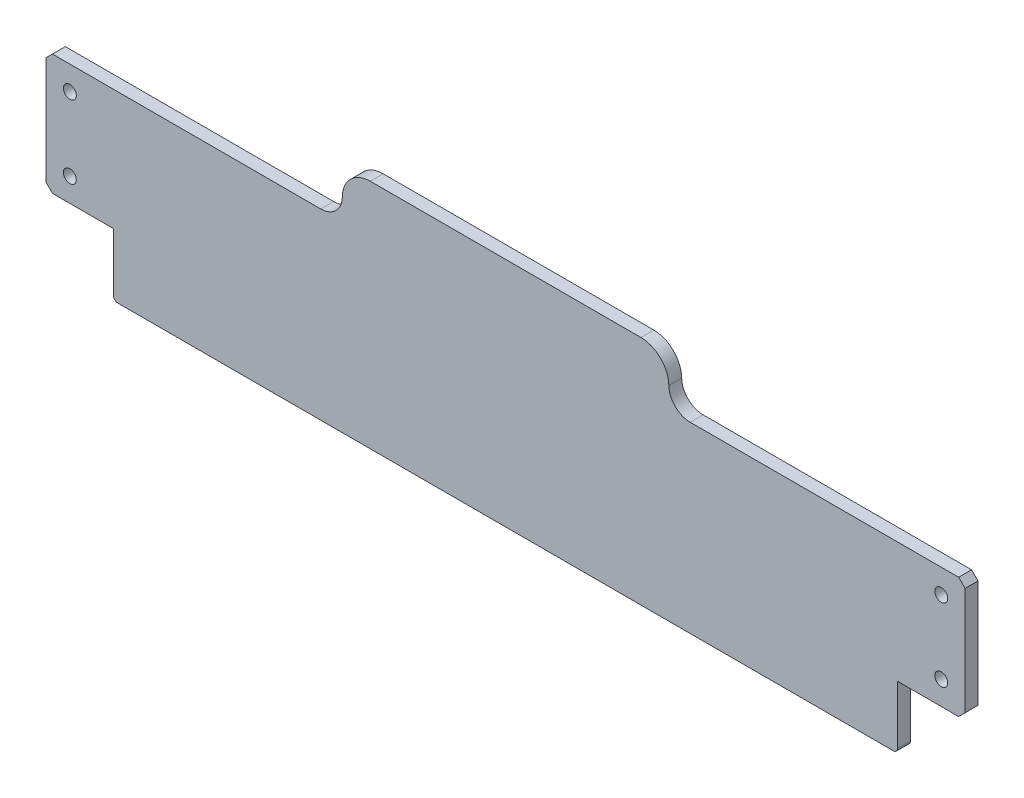
ISO-10303-21;
HEADER;
FILE_DESCRIPTION(('STEP AP214'),'2;1');
FILE_NAME('part.step','',(''),(''),'','','');
FILE_SCHEMA(('AUTOMOTIVE_DESIGN { 1 0 10303 214 1 1 1 1 }'));
ENDSEC;
DATA;
#1=APPLICATION_CONTEXT('core data for automotive mechanical design processes');
#2=APPLICATION_PROTOCOL_DEFINITION('international standard','automotive_design',2000,#1);
#3=PRODUCT_CONTEXT('',#1,'mechanical');
#4=PRODUCT('Part','Part','',(#3));
#5=PRODUCT_RELATED_PRODUCT_CATEGORY('part','',(#4));
#6=PRODUCT_DEFINITION_FORMATION('','',#4);
#7=PRODUCT_DEFINITION_CONTEXT('part definition',#1,'design');
#8=PRODUCT_DEFINITION('design','',#6,#7);
#9=PRODUCT_DEFINITION_SHAPE('','',#8);
#10=(LENGTH_UNIT() NAMED_UNIT(*) SI_UNIT(.MILLI.,.METRE.));
#11=(NAMED_UNIT(*) PLANE_ANGLE_UNIT() SI_UNIT($,.RADIAN.));
#12=(NAMED_UNIT(*) SI_UNIT($,.STERADIAN.) SOLID_ANGLE_UNIT());
#13=UNCERTAINTY_MEASURE_WITH_UNIT(LENGTH_MEASURE(1.E-05),#10,'distance_accuracy_value','');
#14=(GEOMETRIC_REPRESENTATION_CONTEXT(3) GLOBAL_UNCERTAINTY_ASSIGNED_CONTEXT((#13)) GLOBAL_UNIT_ASSIGNED_CONTEXT((#10,
#11,#12)) REPRESENTATION_CONTEXT('',''));
#15=CARTESIAN_POINT('',(0.,0.,0.));
#16=DIRECTION('',(0.,0.,1.));
#17=DIRECTION('',(1.,0.,0.));
#18=AXIS2_PLACEMENT_3D('',#15,#16,#17);
#19=CARTESIAN_POINT('',(0.,0.,6.));
#20=DIRECTION('',(-1.,0.,0.));
#21=DIRECTION('',(0.,0.,1.));
#22=AXIS2_PLACEMENT_3D('',#19,#20,#21);
#23=PLANE('',#22);
#24=DIRECTION('',(0.,1.,0.));
#25=VECTOR('',#24,1.);
#26=CARTESIAN_POINT('',(0.,0.,0.));
#27=LINE('',#26,#25);
#28=CARTESIAN_POINT('',(0.,-10.,0.));
#29=VERTEX_POINT('',#28);
#30=CARTESIAN_POINT('',(0.,17.,0.));
#31=VERTEX_POINT('',#30);
#32=EDGE_CURVE('E184',#29,#31,#27,.T.);
#33=ORIENTED_EDGE('',*,*,#32,.F.);
#34=DIRECTION('',(0.,0.,1.));
#35=VECTOR('',#34,1.);
#36=CARTESIAN_POINT('',(0.,-10.,6.));
#37=LINE('',#36,#35);
#38=CARTESIAN_POINT('',(0.,-10.,6.));
#39=VERTEX_POINT('',#38);
#40=EDGE_CURVE('E328',#29,#39,#37,.T.);
#41=ORIENTED_EDGE('',*,*,#40,.T.);
#42=DIRECTION('',(0.,1.,0.));
#43=VECTOR('',#42,1.);
#44=CARTESIAN_POINT('',(0.,0.,6.));
#45=LINE('',#44,#43);
#46=CARTESIAN_POINT('',(0.,17.,6.));
#47=VERTEX_POINT('',#46);
#48=EDGE_CURVE('E204',#39,#47,#45,.T.);
#49=ORIENTED_EDGE('',*,*,#48,.T.);
#50=DIRECTION('',(0.,0.,1.));
#51=VECTOR('',#50,1.);
#52=CARTESIAN_POINT('',(0.,17.,0.));
#53=LINE('',#52,#51);
#54=EDGE_CURVE('E202',#31,#47,#53,.T.);
#55=ORIENTED_EDGE('',*,*,#54,.F.);
#56=EDGE_LOOP('',(#33,#41,#49,#55));
#57=FACE_BOUND('',#56,.T.);
#58=ADVANCED_FACE('F44',(#57),#23,.T.);
#59=CARTESIAN_POINT('',(365.,0.,6.));
#60=DIRECTION('',(-1.,0.,0.));
#61=DIRECTION('',(0.,0.,1.));
#62=AXIS2_PLACEMENT_3D('',#59,#60,#61);
#63=PLANE('',#62);
#64=DIRECTION('',(0.,1.,0.));
#65=VECTOR('',#64,1.);
#66=CARTESIAN_POINT('',(365.,0.,6.));
#67=LINE('',#66,#65);
#68=CARTESIAN_POINT('',(365.,-10.,6.));
#69=VERTEX_POINT('',#68);
#70=CARTESIAN_POINT('',(365.,17.,6.));
#71=VERTEX_POINT('',#70);
#72=EDGE_CURVE('E198',#69,#71,#67,.T.);
#73=ORIENTED_EDGE('',*,*,#72,.F.);
#74=DIRECTION('',(0.,0.,1.));
#75=VECTOR('',#74,1.);
#76=CARTESIAN_POINT('',(365.,-10.,0.));
#77=LINE('',#76,#75);
#78=CARTESIAN_POINT('',(365.,-10.,0.));
#79=VERTEX_POINT('',#78);
#80=EDGE_CURVE('E349',#69,#79,#77,.F.);
#81=ORIENTED_EDGE('',*,*,#80,.T.);
#82=DIRECTION('',(0.,1.,0.));
#83=VECTOR('',#82,1.);
#84=CARTESIAN_POINT('',(365.,0.,0.));
#85=LINE('',#84,#83);
#86=CARTESIAN_POINT('',(365.,17.,0.));
#87=VERTEX_POINT('',#86);
#88=EDGE_CURVE('E199',#79,#87,#85,.T.);
#89=ORIENTED_EDGE('',*,*,#88,.T.);
#90=DIRECTION('',(0.,0.,1.));
#91=VECTOR('',#90,1.);
#92=CARTESIAN_POINT('',(365.,17.,0.));
#93=LINE('',#92,#91);
#94=EDGE_CURVE('E224',#87,#71,#93,.T.);
#95=ORIENTED_EDGE('',*,*,#94,.T.);
#96=EDGE_LOOP('',(#73,#81,#89,#95));
#97=FACE_BOUND('',#96,.T.);
#98=ADVANCED_FACE('F449',(#97),#63,.F.);
#99=CARTESIAN_POINT('',(0.,0.,6.));
#100=DIRECTION('',(0.,0.,-1.));
#101=DIRECTION('',(-1.,0.,0.));
#102=AXIS2_PLACEMENT_3D('',#99,#100,#101);
#103=PLANE('',#102);
#104=CARTESIAN_POINT('',(385.300000000001,61.9999999999984,6.));
#105=DIRECTION('',(0.,0.,1.));
#106=DIRECTION('',(-1.,0.,0.));
#107=AXIS2_PLACEMENT_3D('',#104,#105,#106);
#108=CIRCLE('',#107,2.99999999999999);
#109=CARTESIAN_POINT('',(382.300000000001,61.9999999999984,6.));
#110=VERTEX_POINT('',#109);
#111=EDGE_CURVE('E538',#110,#110,#108,.T.);
#112=ORIENTED_EDGE('',*,*,#111,.F.);
#113=EDGE_LOOP('',(#112));
#114=FACE_BOUND('',#113,.T.);
#115=CARTESIAN_POINT('',(385.300000000001,27.9999999999984,6.));
#116=DIRECTION('',(0.,0.,1.));
#117=DIRECTION('',(-1.,0.,0.));
#118=AXIS2_PLACEMENT_3D('',#115,#116,#117);
#119=CIRCLE('',#118,3.00000000000005);
#120=CARTESIAN_POINT('',(382.300000000001,27.9999999999984,6.));
#121=VERTEX_POINT('',#120);
#122=EDGE_CURVE('E542',#121,#121,#119,.T.);
#123=ORIENTED_EDGE('',*,*,#122,.F.);
#124=EDGE_LOOP('',(#123));
#125=FACE_BOUND('',#124,.T.);
#126=CARTESIAN_POINT('',(-20.3000000000008,27.9999999999983,6.));
#127=DIRECTION('',(0.,0.,1.));
#128=DIRECTION('',(1.,0.,0.));
#129=AXIS2_PLACEMENT_3D('',#126,#127,#128);
#130=CIRCLE('',#129,3.);
#131=CARTESIAN_POINT('',(-17.3000000000008,27.9999999999983,6.));
#132=VERTEX_POINT('',#131);
#133=EDGE_CURVE('E546',#132,#132,#130,.T.);
#134=ORIENTED_EDGE('',*,*,#133,.F.);
#135=EDGE_LOOP('',(#134));
#136=FACE_BOUND('',#135,.T.);
#137=CARTESIAN_POINT('',(-20.3000000000008,61.9999999999983,6.));
#138=DIRECTION('',(0.,0.,1.));
#139=DIRECTION('',(1.,0.,0.));
#140=AXIS2_PLACEMENT_3D('',#137,#138,#139);
#141=CIRCLE('',#140,3.);
#142=CARTESIAN_POINT('',(-17.3000000000008,61.9999999999983,6.));
#143=VERTEX_POINT('',#142);
#144=EDGE_CURVE('E417',#143,#143,#141,.T.);
#145=ORIENTED_EDGE('',*,*,#144,.F.);
#146=EDGE_LOOP('',(#145));
#147=FACE_BOUND('',#146,.T.);
#148=DIRECTION('',(1.,0.,0.));
#149=VECTOR('',#148,1.);
#150=CARTESIAN_POINT('',(106.522108858322,95.8688020435436,6.));
#151=LINE('',#150,#149);
#152=CARTESIAN_POINT('',(119.520134136822,95.8688020435436,6.));
#153=VERTEX_POINT('',#152);
#154=CARTESIAN_POINT('',(245.479865863178,95.8688020435436,6.));
#155=VERTEX_POINT('',#154);
#156=EDGE_CURVE('E382',#153,#155,#151,.T.);
#157=ORIENTED_EDGE('',*,*,#156,.F.);
#158=CARTESIAN_POINT('',(119.520134136822,82.8688020435436,6.));
#159=DIRECTION('',(0.,0.,-1.));
#160=DIRECTION('',(-1.,0.,0.));
#161=AXIS2_PLACEMENT_3D('',#158,#159,#160);
#162=CIRCLE('',#161,13.);
#163=CARTESIAN_POINT('',(106.521250283756,83.0391504351327,6.));
#164=VERTEX_POINT('',#163);
#165=EDGE_CURVE('E362',#153,#164,#162,.F.);
#166=ORIENTED_EDGE('',*,*,#165,.T.);
#167=CARTESIAN_POINT('',(96.5221088583215,83.170187659432,6.));
#168=DIRECTION('',(0.,0.,-1.));
#169=DIRECTION('',(-1.,0.,0.));
#170=AXIS2_PLACEMENT_3D('',#167,#168,#169);
#171=CIRCLE('',#170,10.);
#172=CARTESIAN_POINT('',(96.5221088583215,73.170187659432,6.));
#173=VERTEX_POINT('',#172);
#174=EDGE_CURVE('E271',#164,#173,#171,.T.);
#175=ORIENTED_EDGE('',*,*,#174,.T.);
#176=DIRECTION('',(1.,0.,0.));
#177=VECTOR('',#176,1.);
#178=CARTESIAN_POINT('',(18.5737252637614,73.170187659432,6.));
#179=LINE('',#178,#177);
#180=CARTESIAN_POINT('',(-28.4,73.170187659432,6.));
#181=VERTEX_POINT('',#180);
#182=EDGE_CURVE('E236',#181,#173,#179,.T.);
#183=ORIENTED_EDGE('',*,*,#182,.F.);
#184=DIRECTION('',(-0.707106781186541,-0.707106781186554,0.));
#185=VECTOR('',#184,1.);
#186=CARTESIAN_POINT('',(-28.4,73.170187659432,6.));
#187=LINE('',#186,#185);
#188=CARTESIAN_POINT('',(-31.4,70.1701876594319,6.));
#189=VERTEX_POINT('',#188);
#190=EDGE_CURVE('E290',#181,#189,#187,.T.);
#191=ORIENTED_EDGE('',*,*,#190,.T.);
#192=DIRECTION('',(0.,-1.,0.));
#193=VECTOR('',#192,1.);
#194=CARTESIAN_POINT('',(-31.4,17.,6.));
#195=LINE('',#194,#193);
#196=CARTESIAN_POINT('',(-31.4,19.9999999999999,6.));
#197=VERTEX_POINT('',#196);
#198=EDGE_CURVE('E402',#189,#197,#195,.T.);
#199=ORIENTED_EDGE('',*,*,#198,.T.);
#200=DIRECTION('',(0.707106781186548,-0.707106781186548,0.));
#201=VECTOR('',#200,1.);
#202=CARTESIAN_POINT('',(-31.4,19.9999999999999,6.));
#203=LINE('',#202,#201);
#204=CARTESIAN_POINT('',(-28.4000000000001,17.,6.));
#205=VERTEX_POINT('',#204);
#206=EDGE_CURVE('E287',#197,#205,#203,.T.);
#207=ORIENTED_EDGE('',*,*,#206,.T.);
#208=DIRECTION('',(-1.,0.,0.));
#209=VECTOR('',#208,1.);
#210=CARTESIAN_POINT('',(0.,17.,6.));
#211=LINE('',#210,#209);
#212=EDGE_CURVE('E215',#47,#205,#211,.T.);
#213=ORIENTED_EDGE('',*,*,#212,.F.);
#214=ORIENTED_EDGE('',*,*,#48,.F.);
#215=CARTESIAN_POINT('',(2.,-10.,6.));
#216=DIRECTION('',(0.,0.,-1.));
#217=DIRECTION('',(-1.,0.,0.));
#218=AXIS2_PLACEMENT_3D('',#215,#216,#217);
#219=CIRCLE('',#218,2.);
#220=CARTESIAN_POINT('',(2.,-12.,6.));
#221=VERTEX_POINT('',#220);
#222=EDGE_CURVE('E334',#39,#221,#219,.F.);
#223=ORIENTED_EDGE('',*,*,#222,.T.);
#224=DIRECTION('',(1.,0.,0.));
#225=VECTOR('',#224,1.);
#226=CARTESIAN_POINT('',(0.,-12.,6.));
#227=LINE('',#226,#225);
#228=CARTESIAN_POINT('',(363.,-12.,6.));
#229=VERTEX_POINT('',#228);
#230=EDGE_CURVE('E221',#221,#229,#227,.T.);
#231=ORIENTED_EDGE('',*,*,#230,.T.);
#232=CARTESIAN_POINT('',(363.,-10.,6.));
#233=DIRECTION('',(0.,0.,-1.));
#234=DIRECTION('',(-1.,0.,0.));
#235=AXIS2_PLACEMENT_3D('',#232,#233,#234);
#236=CIRCLE('',#235,2.);
#237=EDGE_CURVE('E331',#229,#69,#236,.F.);
#238=ORIENTED_EDGE('',*,*,#237,.T.);
#239=ORIENTED_EDGE('',*,*,#72,.T.);
#240=DIRECTION('',(-1.,0.,0.));
#241=VECTOR('',#240,1.);
#242=CARTESIAN_POINT('',(365.,17.,6.));
#243=LINE('',#242,#241);
#244=CARTESIAN_POINT('',(393.4,17.,6.));
#245=VERTEX_POINT('',#244);
#246=EDGE_CURVE('E218',#245,#71,#243,.T.);
#247=ORIENTED_EDGE('',*,*,#246,.F.);
#248=DIRECTION('',(0.707106781186548,0.707106781186548,0.));
#249=VECTOR('',#248,1.);
#250=CARTESIAN_POINT('',(393.4,17.,6.));
#251=LINE('',#250,#249);
#252=CARTESIAN_POINT('',(396.4,20.,6.));
#253=VERTEX_POINT('',#252);
#254=EDGE_CURVE('E284',#245,#253,#251,.T.);
#255=ORIENTED_EDGE('',*,*,#254,.T.);
#256=DIRECTION('',(0.,1.,0.));
#257=VECTOR('',#256,1.);
#258=CARTESIAN_POINT('',(396.4,17.,6.));
#259=LINE('',#258,#257);
#260=CARTESIAN_POINT('',(396.4,70.170187659432,6.));
#261=VERTEX_POINT('',#260);
#262=EDGE_CURVE('E407',#253,#261,#259,.T.);
#263=ORIENTED_EDGE('',*,*,#262,.T.);
#264=DIRECTION('',(-0.707106781186541,0.707106781186554,0.));
#265=VECTOR('',#264,1.);
#266=CARTESIAN_POINT('',(396.4,70.170187659432,6.));
#267=LINE('',#266,#265);
#268=CARTESIAN_POINT('',(393.4,73.1701876594321,6.));
#269=VERTEX_POINT('',#268);
#270=EDGE_CURVE('E281',#261,#269,#267,.T.);
#271=ORIENTED_EDGE('',*,*,#270,.T.);
#272=DIRECTION('',(1.,0.,0.));
#273=VECTOR('',#272,1.);
#274=CARTESIAN_POINT('',(346.426274736239,73.170187659432,6.));
#275=LINE('',#274,#273);
#276=CARTESIAN_POINT('',(268.477891141679,73.170187659432,6.));
#277=VERTEX_POINT('',#276);
#278=EDGE_CURVE('E209',#277,#269,#275,.T.);
#279=ORIENTED_EDGE('',*,*,#278,.F.);
#280=CARTESIAN_POINT('',(268.477891141679,83.170187659432,6.));
#281=DIRECTION('',(0.,0.,-1.));
#282=DIRECTION('',(-1.,0.,0.));
#283=AXIS2_PLACEMENT_3D('',#280,#281,#282);
#284=CIRCLE('',#283,10.);
#285=CARTESIAN_POINT('',(258.478749716244,83.0391504351327,6.));
#286=VERTEX_POINT('',#285);
#287=EDGE_CURVE('E264',#277,#286,#284,.T.);
#288=ORIENTED_EDGE('',*,*,#287,.T.);
#289=CARTESIAN_POINT('',(245.479865863178,82.8688020435436,6.));
#290=DIRECTION('',(0.,0.,-1.));
#291=DIRECTION('',(-1.,0.,0.));
#292=AXIS2_PLACEMENT_3D('',#289,#290,#291);
#293=CIRCLE('',#292,13.);
#294=EDGE_CURVE('E359',#286,#155,#293,.F.);
#295=ORIENTED_EDGE('',*,*,#294,.T.);
#296=EDGE_LOOP('',(#157,#166,#175,#183,#191,#199,#207,#213,#214,#223,#231,#238,#239,#247,#255,
#263,#271,#279,#288,#295));
#297=FACE_BOUND('',#296,.T.);
#298=ADVANCED_FACE('F386',(#114,#125,#136,#147,#297),#103,.F.);
#299=CARTESIAN_POINT('',(0.,0.,0.));
#300=DIRECTION('',(0.,0.,-1.));
#301=DIRECTION('',(-1.,0.,0.));
#302=AXIS2_PLACEMENT_3D('',#299,#300,#301);
#303=PLANE('',#302);
#304=CARTESIAN_POINT('',(96.5221088583215,83.170187659432,0.));
#305=DIRECTION('',(0.,0.,-1.));
#306=DIRECTION('',(-1.,0.,0.));
#307=AXIS2_PLACEMENT_3D('',#304,#305,#306);
#308=CIRCLE('',#307,10.);
#309=CARTESIAN_POINT('',(96.5221088583215,73.170187659432,0.));
#310=VERTEX_POINT('',#309);
#311=CARTESIAN_POINT('',(106.521250283756,83.0391504351327,0.));
#312=VERTEX_POINT('',#311);
#313=EDGE_CURVE('E274',#310,#312,#308,.F.);
#314=ORIENTED_EDGE('',*,*,#313,.T.);
#315=CARTESIAN_POINT('',(119.520134136822,82.8688020435436,0.));
#316=DIRECTION('',(0.,0.,-1.));
#317=DIRECTION('',(-1.,0.,0.));
#318=AXIS2_PLACEMENT_3D('',#315,#316,#317);
#319=CIRCLE('',#318,13.);
#320=CARTESIAN_POINT('',(119.520134136822,95.8688020435436,0.));
#321=VERTEX_POINT('',#320);
#322=EDGE_CURVE('E53',#312,#321,#319,.T.);
#323=ORIENTED_EDGE('',*,*,#322,.T.);
#324=DIRECTION('',(1.,0.,0.));
#325=VECTOR('',#324,1.);
#326=CARTESIAN_POINT('',(106.522108858322,95.8688020435436,0.));
#327=LINE('',#326,#325);
#328=CARTESIAN_POINT('',(245.479865863178,95.8688020435436,0.));
#329=VERTEX_POINT('',#328);
#330=EDGE_CURVE('E371',#321,#329,#327,.T.);
#331=ORIENTED_EDGE('',*,*,#330,.T.);
#332=CARTESIAN_POINT('',(245.479865863178,82.8688020435436,0.));
#333=DIRECTION('',(0.,0.,-1.));
#334=DIRECTION('',(-1.,0.,0.));
#335=AXIS2_PLACEMENT_3D('',#332,#333,#334);
#336=CIRCLE('',#335,13.);
#337=CARTESIAN_POINT('',(258.478749716244,83.0391504351327,0.));
#338=VERTEX_POINT('',#337);
#339=EDGE_CURVE('E60',#329,#338,#336,.T.);
#340=ORIENTED_EDGE('',*,*,#339,.T.);
#341=CARTESIAN_POINT('',(268.477891141679,83.170187659432,0.));
#342=DIRECTION('',(0.,0.,-1.));
#343=DIRECTION('',(-1.,0.,0.));
#344=AXIS2_PLACEMENT_3D('',#341,#342,#343);
#345=CIRCLE('',#344,10.);
#346=CARTESIAN_POINT('',(268.477891141679,73.170187659432,0.));
#347=VERTEX_POINT('',#346);
#348=EDGE_CURVE('E268',#338,#347,#345,.F.);
#349=ORIENTED_EDGE('',*,*,#348,.T.);
#350=DIRECTION('',(-1.,0.,0.));
#351=VECTOR('',#350,1.);
#352=CARTESIAN_POINT('',(0.,73.1701876594319,0.));
#353=LINE('',#352,#351);
#354=CARTESIAN_POINT('',(393.4,73.1701876594321,0.));
#355=VERTEX_POINT('',#354);
#356=EDGE_CURVE('E247',#355,#347,#353,.T.);
#357=ORIENTED_EDGE('',*,*,#356,.F.);
#358=DIRECTION('',(0.707106781186541,-0.707106781186554,0.));
#359=VECTOR('',#358,1.);
#360=CARTESIAN_POINT('',(233.28509382972,233.285093829715,0.));
#361=LINE('',#360,#359);
#362=CARTESIAN_POINT('',(396.4,70.170187659432,0.));
#363=VERTEX_POINT('',#362);
#364=EDGE_CURVE('E300',#355,#363,#361,.T.);
#365=ORIENTED_EDGE('',*,*,#364,.T.);
#366=DIRECTION('',(0.,1.,0.));
#367=VECTOR('',#366,1.);
#368=CARTESIAN_POINT('',(396.4,17.,0.));
#369=LINE('',#368,#367);
#370=CARTESIAN_POINT('',(396.4,20.,0.));
#371=VERTEX_POINT('',#370);
#372=EDGE_CURVE('E412',#371,#363,#369,.T.);
#373=ORIENTED_EDGE('',*,*,#372,.F.);
#374=DIRECTION('',(-0.707106781186548,-0.707106781186548,0.));
#375=VECTOR('',#374,1.);
#376=CARTESIAN_POINT('',(188.2,-188.2,0.));
#377=LINE('',#376,#375);
#378=CARTESIAN_POINT('',(393.4,17.,0.));
#379=VERTEX_POINT('',#378);
#380=EDGE_CURVE('E303',#371,#379,#377,.T.);
#381=ORIENTED_EDGE('',*,*,#380,.T.);
#382=DIRECTION('',(-1.,0.,0.));
#383=VECTOR('',#382,1.);
#384=CARTESIAN_POINT('',(365.,17.,0.));
#385=LINE('',#384,#383);
#386=EDGE_CURVE('E228',#379,#87,#385,.T.);
#387=ORIENTED_EDGE('',*,*,#386,.T.);
#388=ORIENTED_EDGE('',*,*,#88,.F.);
#389=CARTESIAN_POINT('',(363.,-10.,0.));
#390=DIRECTION('',(0.,0.,-1.));
#391=DIRECTION('',(-1.,0.,0.));
#392=AXIS2_PLACEMENT_3D('',#389,#390,#391);
#393=CIRCLE('',#392,2.);
#394=CARTESIAN_POINT('',(363.,-12.,0.));
#395=VERTEX_POINT('',#394);
#396=EDGE_CURVE('E344',#79,#395,#393,.T.);
#397=ORIENTED_EDGE('',*,*,#396,.T.);
#398=DIRECTION('',(1.,0.,0.));
#399=VECTOR('',#398,1.);
#400=CARTESIAN_POINT('',(0.,-12.,0.));
#401=LINE('',#400,#399);
#402=CARTESIAN_POINT('',(2.,-12.,0.));
#403=VERTEX_POINT('',#402);
#404=EDGE_CURVE('E229',#403,#395,#401,.T.);
#405=ORIENTED_EDGE('',*,*,#404,.F.);
#406=CARTESIAN_POINT('',(2.,-10.,0.));
#407=DIRECTION('',(0.,0.,-1.));
#408=DIRECTION('',(-1.,0.,0.));
#409=AXIS2_PLACEMENT_3D('',#406,#407,#408);
#410=CIRCLE('',#409,2.);
#411=EDGE_CURVE('E193',#403,#29,#410,.T.);
#412=ORIENTED_EDGE('',*,*,#411,.T.);
#413=ORIENTED_EDGE('',*,*,#32,.T.);
#414=DIRECTION('',(-1.,0.,0.));
#415=VECTOR('',#414,1.);
#416=CARTESIAN_POINT('',(0.,17.,0.));
#417=LINE('',#416,#415);
#418=CARTESIAN_POINT('',(-28.4000000000001,17.,0.));
#419=VERTEX_POINT('',#418);
#420=EDGE_CURVE('E189',#31,#419,#417,.T.);
#421=ORIENTED_EDGE('',*,*,#420,.T.);
#422=DIRECTION('',(-0.707106781186548,0.707106781186548,0.));
#423=VECTOR('',#422,1.);
#424=CARTESIAN_POINT('',(-5.70000000000005,-5.70000000000005,0.));
#425=LINE('',#424,#423);
#426=CARTESIAN_POINT('',(-31.4,19.9999999999999,0.));
#427=VERTEX_POINT('',#426);
#428=EDGE_CURVE('E306',#419,#427,#425,.T.);
#429=ORIENTED_EDGE('',*,*,#428,.T.);
#430=DIRECTION('',(0.,-1.,0.));
#431=VECTOR('',#430,1.);
#432=CARTESIAN_POINT('',(-31.4,17.,0.));
#433=LINE('',#432,#431);
#434=CARTESIAN_POINT('',(-31.4,70.1701876594319,0.));
#435=VERTEX_POINT('',#434);
#436=EDGE_CURVE('E396',#435,#427,#433,.T.);
#437=ORIENTED_EDGE('',*,*,#436,.F.);
#438=DIRECTION('',(0.707106781186541,0.707106781186554,0.));
#439=VECTOR('',#438,1.);
#440=CARTESIAN_POINT('',(-50.7850938297163,50.7850938297153,0.));
#441=LINE('',#440,#439);
#442=CARTESIAN_POINT('',(-28.4,73.170187659432,0.));
#443=VERTEX_POINT('',#442);
#444=EDGE_CURVE('E309',#435,#443,#441,.T.);
#445=ORIENTED_EDGE('',*,*,#444,.T.);
#446=DIRECTION('',(-1.,0.,0.));
#447=VECTOR('',#446,1.);
#448=CARTESIAN_POINT('',(0.,73.170187659432,0.));
#449=LINE('',#448,#447);
#450=EDGE_CURVE('E253',#310,#443,#449,.T.);
#451=ORIENTED_EDGE('',*,*,#450,.F.);
#452=EDGE_LOOP('',(#314,#323,#331,#340,#349,#357,#365,#373,#381,#387,#388,#397,#405,#412,#413,
#421,#429,#437,#445,#451));
#453=FACE_BOUND('',#452,.T.);
#454=CARTESIAN_POINT('',(385.300000000001,61.9999999999984,0.));
#455=DIRECTION('',(0.,0.,1.));
#456=DIRECTION('',(-1.,0.,0.));
#457=AXIS2_PLACEMENT_3D('',#454,#455,#456);
#458=CIRCLE('',#457,2.99999999999999);
#459=CARTESIAN_POINT('',(382.300000000001,61.9999999999984,0.));
#460=VERTEX_POINT('',#459);
#461=EDGE_CURVE('E381',#460,#460,#458,.T.);
#462=ORIENTED_EDGE('',*,*,#461,.T.);
#463=EDGE_LOOP('',(#462));
#464=FACE_BOUND('',#463,.T.);
#465=CARTESIAN_POINT('',(385.300000000001,27.9999999999984,0.));
#466=DIRECTION('',(0.,0.,1.));
#467=DIRECTION('',(-1.,0.,0.));
#468=AXIS2_PLACEMENT_3D('',#465,#466,#467);
#469=CIRCLE('',#468,3.00000000000005);
#470=CARTESIAN_POINT('',(382.300000000001,27.9999999999984,0.));
#471=VERTEX_POINT('',#470);
#472=EDGE_CURVE('E564',#471,#471,#469,.T.);
#473=ORIENTED_EDGE('',*,*,#472,.T.);
#474=EDGE_LOOP('',(#473));
#475=FACE_BOUND('',#474,.T.);
#476=CARTESIAN_POINT('',(-20.3000000000008,27.9999999999983,0.));
#477=DIRECTION('',(0.,0.,1.));
#478=DIRECTION('',(1.,0.,0.));
#479=AXIS2_PLACEMENT_3D('',#476,#477,#478);
#480=CIRCLE('',#479,3.);
#481=CARTESIAN_POINT('',(-17.3000000000008,27.9999999999983,0.));
#482=VERTEX_POINT('',#481);
#483=EDGE_CURVE('E554',#482,#482,#480,.T.);
#484=ORIENTED_EDGE('',*,*,#483,.T.);
#485=EDGE_LOOP('',(#484));
#486=FACE_BOUND('',#485,.T.);
#487=CARTESIAN_POINT('',(-20.3000000000008,61.9999999999983,0.));
#488=DIRECTION('',(0.,0.,1.));
#489=DIRECTION('',(1.,0.,0.));
#490=AXIS2_PLACEMENT_3D('',#487,#488,#489);
#491=CIRCLE('',#490,3.);
#492=CARTESIAN_POINT('',(-17.3000000000008,61.9999999999983,0.));
#493=VERTEX_POINT('',#492);
#494=EDGE_CURVE('E414',#493,#493,#491,.T.);
#495=ORIENTED_EDGE('',*,*,#494,.T.);
#496=EDGE_LOOP('',(#495));
#497=FACE_BOUND('',#496,.T.);
#498=ADVANCED_FACE('F186',(#453,#464,#475,#486,#497),#303,.T.);
#499=CARTESIAN_POINT('',(346.426274736239,73.170187659432,-4.));
#500=DIRECTION('',(0.,-1.,0.));
#501=DIRECTION('',(1.,0.,0.));
#502=AXIS2_PLACEMENT_3D('',#499,#500,#501);
#503=PLANE('',#502);
#504=ORIENTED_EDGE('',*,*,#278,.T.);
#505=DIRECTION('',(0.,0.,-1.));
#506=VECTOR('',#505,1.);
#507=CARTESIAN_POINT('',(393.4,73.1701876594321,0.));
#508=LINE('',#507,#506);
#509=EDGE_CURVE('E325',#269,#355,#508,.T.);
#510=ORIENTED_EDGE('',*,*,#509,.T.);
#511=ORIENTED_EDGE('',*,*,#356,.T.);
#512=DIRECTION('',(0.,0.,1.));
#513=VECTOR('',#512,1.);
#514=CARTESIAN_POINT('',(268.477891141679,73.170187659432,6.));
#515=LINE('',#514,#513);
#516=EDGE_CURVE('E257',#347,#277,#515,.T.);
#517=ORIENTED_EDGE('',*,*,#516,.T.);
#518=EDGE_LOOP('',(#504,#510,#511,#517));
#519=FACE_BOUND('',#518,.T.);
#520=ADVANCED_FACE('F526',(#519),#503,.F.);
#521=CARTESIAN_POINT('',(18.5737252637614,73.170187659432,-4.));
#522=DIRECTION('',(0.,-1.,0.));
#523=DIRECTION('',(0.,0.,-1.));
#524=AXIS2_PLACEMENT_3D('',#521,#522,#523);
#525=PLANE('',#524);
#526=ORIENTED_EDGE('',*,*,#450,.T.);
#527=DIRECTION('',(0.,0.,1.));
#528=VECTOR('',#527,1.);
#529=CARTESIAN_POINT('',(-28.4,73.170187659432,6.));
#530=LINE('',#529,#528);
#531=EDGE_CURVE('E277',#443,#181,#530,.T.);
#532=ORIENTED_EDGE('',*,*,#531,.T.);
#533=ORIENTED_EDGE('',*,*,#182,.T.);
#534=DIRECTION('',(0.,0.,1.));
#535=VECTOR('',#534,1.);
#536=CARTESIAN_POINT('',(96.5221088583215,73.170187659432,0.));
#537=LINE('',#536,#535);
#538=EDGE_CURVE('E261',#173,#310,#537,.F.);
#539=ORIENTED_EDGE('',*,*,#538,.T.);
#540=EDGE_LOOP('',(#526,#532,#533,#539));
#541=FACE_BOUND('',#540,.T.);
#542=ADVANCED_FACE('F391',(#541),#525,.F.);
#543=CARTESIAN_POINT('',(268.477891141679,83.170187659432,-4.));
#544=DIRECTION('',(0.,0.,-1.));
#545=DIRECTION('',(-1.,0.,0.));
#546=AXIS2_PLACEMENT_3D('',#543,#544,#545);
#547=CYLINDRICAL_SURFACE('',#546,10.);
#548=ORIENTED_EDGE('',*,*,#348,.F.);
#549=DIRECTION('',(0.,0.,-1.));
#550=VECTOR('',#549,1.);
#551=CARTESIAN_POINT('',(258.478749716244,83.0391504351327,-4.));
#552=LINE('',#551,#550);
#553=EDGE_CURVE('E11',#338,#286,#552,.F.);
#554=ORIENTED_EDGE('',*,*,#553,.T.);
#555=ORIENTED_EDGE('',*,*,#287,.F.);
#556=ORIENTED_EDGE('',*,*,#516,.F.);
#557=EDGE_LOOP('',(#548,#554,#555,#556));
#558=FACE_BOUND('',#557,.T.);
#559=ADVANCED_FACE('F459',(#558),#547,.F.);
#560=CARTESIAN_POINT('',(96.5221088583215,83.170187659432,-4.));
#561=DIRECTION('',(0.,0.,-1.));
#562=DIRECTION('',(-1.,0.,0.));
#563=AXIS2_PLACEMENT_3D('',#560,#561,#562);
#564=CYLINDRICAL_SURFACE('',#563,10.);
#565=ORIENTED_EDGE('',*,*,#174,.F.);
#566=DIRECTION('',(0.,0.,-1.));
#567=VECTOR('',#566,1.);
#568=CARTESIAN_POINT('',(106.521250283756,83.0391504351327,-4.));
#569=LINE('',#568,#567);
#570=EDGE_CURVE('E68',#164,#312,#569,.T.);
#571=ORIENTED_EDGE('',*,*,#570,.T.);
#572=ORIENTED_EDGE('',*,*,#313,.F.);
#573=ORIENTED_EDGE('',*,*,#538,.F.);
#574=EDGE_LOOP('',(#565,#571,#572,#573));
#575=FACE_BOUND('',#574,.T.);
#576=ADVANCED_FACE('F389',(#575),#564,.F.);
#577=CARTESIAN_POINT('',(365.,17.,0.));
#578=DIRECTION('',(0.,1.,0.));
#579=DIRECTION('',(0.,0.,1.));
#580=AXIS2_PLACEMENT_3D('',#577,#578,#579);
#581=PLANE('',#580);
#582=ORIENTED_EDGE('',*,*,#386,.F.);
#583=DIRECTION('',(0.,0.,1.));
#584=VECTOR('',#583,1.);
#585=CARTESIAN_POINT('',(393.4,17.,6.));
#586=LINE('',#585,#584);
#587=EDGE_CURVE('E314',#379,#245,#586,.T.);
#588=ORIENTED_EDGE('',*,*,#587,.T.);
#589=ORIENTED_EDGE('',*,*,#246,.T.);
#590=ORIENTED_EDGE('',*,*,#94,.F.);
#591=EDGE_LOOP('',(#582,#588,#589,#590));
#592=FACE_BOUND('',#591,.T.);
#593=ADVANCED_FACE('F464',(#592),#581,.F.);
#594=CARTESIAN_POINT('',(0.,17.,0.));
#595=DIRECTION('',(0.,1.,0.));
#596=DIRECTION('',(0.,0.,1.));
#597=AXIS2_PLACEMENT_3D('',#594,#595,#596);
#598=PLANE('',#597);
#599=ORIENTED_EDGE('',*,*,#212,.T.);
#600=DIRECTION('',(0.,0.,-1.));
#601=VECTOR('',#600,1.);
#602=CARTESIAN_POINT('',(-28.4000000000001,17.,0.));
#603=LINE('',#602,#601);
#604=EDGE_CURVE('E213',#205,#419,#603,.T.);
#605=ORIENTED_EDGE('',*,*,#604,.T.);
#606=ORIENTED_EDGE('',*,*,#420,.F.);
#607=ORIENTED_EDGE('',*,*,#54,.T.);
#608=EDGE_LOOP('',(#599,#605,#606,#607));
#609=FACE_BOUND('',#608,.T.);
#610=ADVANCED_FACE('F211',(#609),#598,.F.);
#611=CARTESIAN_POINT('',(0.,-12.,0.));
#612=DIRECTION('',(0.,-1.,0.));
#613=DIRECTION('',(0.,0.,-1.));
#614=AXIS2_PLACEMENT_3D('',#611,#612,#613);
#615=PLANE('',#614);
#616=ORIENTED_EDGE('',*,*,#230,.F.);
#617=DIRECTION('',(0.,0.,1.));
#618=VECTOR('',#617,1.);
#619=CARTESIAN_POINT('',(2.,-12.,0.));
#620=LINE('',#619,#618);
#621=EDGE_CURVE('E341',#221,#403,#620,.F.);
#622=ORIENTED_EDGE('',*,*,#621,.T.);
#623=ORIENTED_EDGE('',*,*,#404,.T.);
#624=DIRECTION('',(0.,0.,1.));
#625=VECTOR('',#624,1.);
#626=CARTESIAN_POINT('',(363.,-12.,6.));
#627=LINE('',#626,#625);
#628=EDGE_CURVE('E337',#395,#229,#627,.T.);
#629=ORIENTED_EDGE('',*,*,#628,.T.);
#630=EDGE_LOOP('',(#616,#622,#623,#629));
#631=FACE_BOUND('',#630,.T.);
#632=ADVANCED_FACE('F431',(#631),#615,.T.);
#633=CARTESIAN_POINT('',(396.4,17.,0.));
#634=DIRECTION('',(1.,0.,0.));
#635=DIRECTION('',(0.,0.,-1.));
#636=AXIS2_PLACEMENT_3D('',#633,#634,#635);
#637=PLANE('',#636);
#638=ORIENTED_EDGE('',*,*,#262,.F.);
#639=DIRECTION('',(0.,0.,-1.));
#640=VECTOR('',#639,1.);
#641=CARTESIAN_POINT('',(396.4,20.,0.));
#642=LINE('',#641,#640);
#643=EDGE_CURVE('E322',#253,#371,#642,.T.);
#644=ORIENTED_EDGE('',*,*,#643,.T.);
#645=ORIENTED_EDGE('',*,*,#372,.T.);
#646=DIRECTION('',(0.,0.,1.));
#647=VECTOR('',#646,1.);
#648=CARTESIAN_POINT('',(396.4,70.170187659432,6.));
#649=LINE('',#648,#647);
#650=EDGE_CURVE('E318',#363,#261,#649,.T.);
#651=ORIENTED_EDGE('',*,*,#650,.T.);
#652=EDGE_LOOP('',(#638,#644,#645,#651));
#653=FACE_BOUND('',#652,.T.);
#654=ADVANCED_FACE('F513',(#653),#637,.T.);
#655=CARTESIAN_POINT('',(-31.4,17.,0.));
#656=DIRECTION('',(-1.,0.,0.));
#657=DIRECTION('',(0.,0.,1.));
#658=AXIS2_PLACEMENT_3D('',#655,#656,#657);
#659=PLANE('',#658);
#660=ORIENTED_EDGE('',*,*,#198,.F.);
#661=DIRECTION('',(0.,0.,-1.));
#662=VECTOR('',#661,1.);
#663=CARTESIAN_POINT('',(-31.4,70.1701876594319,0.));
#664=LINE('',#663,#662);
#665=EDGE_CURVE('E297',#189,#435,#664,.T.);
#666=ORIENTED_EDGE('',*,*,#665,.T.);
#667=ORIENTED_EDGE('',*,*,#436,.T.);
#668=DIRECTION('',(0.,0.,1.));
#669=VECTOR('',#668,1.);
#670=CARTESIAN_POINT('',(-31.4,19.9999999999999,6.));
#671=LINE('',#670,#669);
#672=EDGE_CURVE('E293',#427,#197,#671,.T.);
#673=ORIENTED_EDGE('',*,*,#672,.T.);
#674=EDGE_LOOP('',(#660,#666,#667,#673));
#675=FACE_BOUND('',#674,.T.);
#676=ADVANCED_FACE('F404',(#675),#659,.T.);
#677=CARTESIAN_POINT('',(-28.4,73.170187659432,-4.));
#678=DIRECTION('',(-0.707106781186554,0.707106781186541,0.));
#679=DIRECTION('',(0.,0.,-1.));
#680=AXIS2_PLACEMENT_3D('',#677,#678,#679);
#681=PLANE('',#680);
#682=ORIENTED_EDGE('',*,*,#444,.F.);
#683=ORIENTED_EDGE('',*,*,#665,.F.);
#684=ORIENTED_EDGE('',*,*,#190,.F.);
#685=ORIENTED_EDGE('',*,*,#531,.F.);
#686=EDGE_LOOP('',(#682,#683,#684,#685));
#687=FACE_BOUND('',#686,.T.);
#688=ADVANCED_FACE('F399',(#687),#681,.T.);
#689=CARTESIAN_POINT('',(-31.4,19.9999999999999,0.));
#690=DIRECTION('',(-0.707106781186548,-0.707106781186548,0.));
#691=DIRECTION('',(0.,0.,-1.));
#692=AXIS2_PLACEMENT_3D('',#689,#690,#691);
#693=PLANE('',#692);
#694=ORIENTED_EDGE('',*,*,#428,.F.);
#695=ORIENTED_EDGE('',*,*,#604,.F.);
#696=ORIENTED_EDGE('',*,*,#206,.F.);
#697=ORIENTED_EDGE('',*,*,#672,.F.);
#698=EDGE_LOOP('',(#694,#695,#696,#697));
#699=FACE_BOUND('',#698,.T.);
#700=ADVANCED_FACE('F435',(#699),#693,.T.);
#701=CARTESIAN_POINT('',(393.4,17.,0.));
#702=DIRECTION('',(0.707106781186547,-0.707106781186547,0.));
#703=DIRECTION('',(0.,0.,-1.));
#704=AXIS2_PLACEMENT_3D('',#701,#702,#703);
#705=PLANE('',#704);
#706=ORIENTED_EDGE('',*,*,#380,.F.);
#707=ORIENTED_EDGE('',*,*,#643,.F.);
#708=ORIENTED_EDGE('',*,*,#254,.F.);
#709=ORIENTED_EDGE('',*,*,#587,.F.);
#710=EDGE_LOOP('',(#706,#707,#708,#709));
#711=FACE_BOUND('',#710,.T.);
#712=ADVANCED_FACE('F437',(#711),#705,.T.);
#713=CARTESIAN_POINT('',(396.4,70.170187659432,0.));
#714=DIRECTION('',(0.707106781186554,0.707106781186541,0.));
#715=DIRECTION('',(0.,0.,-1.));
#716=AXIS2_PLACEMENT_3D('',#713,#714,#715);
#717=PLANE('',#716);
#718=ORIENTED_EDGE('',*,*,#364,.F.);
#719=ORIENTED_EDGE('',*,*,#509,.F.);
#720=ORIENTED_EDGE('',*,*,#270,.F.);
#721=ORIENTED_EDGE('',*,*,#650,.F.);
#722=EDGE_LOOP('',(#718,#719,#720,#721));
#723=FACE_BOUND('',#722,.T.);
#724=ADVANCED_FACE('F443',(#723),#717,.T.);
#725=CARTESIAN_POINT('',(2.,-10.,6.));
#726=DIRECTION('',(0.,0.,1.));
#727=DIRECTION('',(1.,0.,0.));
#728=AXIS2_PLACEMENT_3D('',#725,#726,#727);
#729=CYLINDRICAL_SURFACE('',#728,2.);
#730=ORIENTED_EDGE('',*,*,#411,.F.);
#731=ORIENTED_EDGE('',*,*,#621,.F.);
#732=ORIENTED_EDGE('',*,*,#222,.F.);
#733=ORIENTED_EDGE('',*,*,#40,.F.);
#734=EDGE_LOOP('',(#730,#731,#732,#733));
#735=FACE_BOUND('',#734,.T.);
#736=ADVANCED_FACE('F433',(#735),#729,.T.);
#737=CARTESIAN_POINT('',(363.,-10.,0.));
#738=DIRECTION('',(0.,0.,-1.));
#739=DIRECTION('',(-1.,0.,0.));
#740=AXIS2_PLACEMENT_3D('',#737,#738,#739);
#741=CYLINDRICAL_SURFACE('',#740,2.);
#742=ORIENTED_EDGE('',*,*,#396,.F.);
#743=ORIENTED_EDGE('',*,*,#80,.F.);
#744=ORIENTED_EDGE('',*,*,#237,.F.);
#745=ORIENTED_EDGE('',*,*,#628,.F.);
#746=EDGE_LOOP('',(#742,#743,#744,#745));
#747=FACE_BOUND('',#746,.T.);
#748=ADVANCED_FACE('F482',(#747),#741,.T.);
#749=CARTESIAN_POINT('',(-20.3000000000008,61.9999999999983,0.));
#750=DIRECTION('',(0.,0.,1.));
#751=DIRECTION('',(1.,0.,0.));
#752=AXIS2_PLACEMENT_3D('',#749,#750,#751);
#753=CYLINDRICAL_SURFACE('',#752,3.);
#754=ORIENTED_EDGE('',*,*,#494,.F.);
#755=EDGE_LOOP('',(#754));
#756=FACE_BOUND('',#755,.T.);
#757=ORIENTED_EDGE('',*,*,#144,.T.);
#758=EDGE_LOOP('',(#757));
#759=FACE_BOUND('',#758,.T.);
#760=ADVANCED_FACE('F484',(#756,#759),#753,.F.);
#761=CARTESIAN_POINT('',(-20.3000000000008,27.9999999999983,0.));
#762=DIRECTION('',(0.,0.,1.));
#763=DIRECTION('',(1.,0.,0.));
#764=AXIS2_PLACEMENT_3D('',#761,#762,#763);
#765=CYLINDRICAL_SURFACE('',#764,3.);
#766=ORIENTED_EDGE('',*,*,#483,.F.);
#767=EDGE_LOOP('',(#766));
#768=FACE_BOUND('',#767,.T.);
#769=ORIENTED_EDGE('',*,*,#133,.T.);
#770=EDGE_LOOP('',(#769));
#771=FACE_BOUND('',#770,.T.);
#772=ADVANCED_FACE('F501',(#768,#771),#765,.F.);
#773=CARTESIAN_POINT('',(385.300000000001,27.9999999999984,0.));
#774=DIRECTION('',(0.,0.,1.));
#775=DIRECTION('',(1.,0.,0.));
#776=AXIS2_PLACEMENT_3D('',#773,#774,#775);
#777=CYLINDRICAL_SURFACE('',#776,3.00000000000005);
#778=ORIENTED_EDGE('',*,*,#472,.F.);
#779=EDGE_LOOP('',(#778));
#780=FACE_BOUND('',#779,.T.);
#781=ORIENTED_EDGE('',*,*,#122,.T.);
#782=EDGE_LOOP('',(#781));
#783=FACE_BOUND('',#782,.T.);
#784=ADVANCED_FACE('F497',(#780,#783),#777,.F.);
#785=CARTESIAN_POINT('',(385.300000000001,61.9999999999984,0.));
#786=DIRECTION('',(0.,0.,1.));
#787=DIRECTION('',(1.,0.,0.));
#788=AXIS2_PLACEMENT_3D('',#785,#786,#787);
#789=CYLINDRICAL_SURFACE('',#788,2.99999999999999);
#790=ORIENTED_EDGE('',*,*,#461,.F.);
#791=EDGE_LOOP('',(#790));
#792=FACE_BOUND('',#791,.T.);
#793=ORIENTED_EDGE('',*,*,#111,.T.);
#794=EDGE_LOOP('',(#793));
#795=FACE_BOUND('',#794,.T.);
#796=ADVANCED_FACE('F492',(#792,#795),#789,.F.);
#797=CARTESIAN_POINT('',(106.522108858322,95.8688020435436,0.));
#798=DIRECTION('',(0.,-1.,0.));
#799=DIRECTION('',(0.,0.,-1.));
#800=AXIS2_PLACEMENT_3D('',#797,#798,#799);
#801=PLANE('',#800);
#802=ORIENTED_EDGE('',*,*,#330,.F.);
#803=DIRECTION('',(0.,0.,-1.));
#804=VECTOR('',#803,1.);
#805=CARTESIAN_POINT('',(119.520134136822,95.8688020435436,0.));
#806=LINE('',#805,#804);
#807=EDGE_CURVE('E355',#321,#153,#806,.F.);
#808=ORIENTED_EDGE('',*,*,#807,.T.);
#809=ORIENTED_EDGE('',*,*,#156,.T.);
#810=DIRECTION('',(0.,0.,-1.));
#811=VECTOR('',#810,1.);
#812=CARTESIAN_POINT('',(245.479865863178,95.8688020435436,0.));
#813=LINE('',#812,#811);
#814=EDGE_CURVE('E352',#155,#329,#813,.T.);
#815=ORIENTED_EDGE('',*,*,#814,.T.);
#816=EDGE_LOOP('',(#802,#808,#809,#815));
#817=FACE_BOUND('',#816,.T.);
#818=ADVANCED_FACE('F376',(#817),#801,.F.);
#819=CARTESIAN_POINT('',(119.520134136822,82.8688020435436,-4.));
#820=DIRECTION('',(0.,0.,-1.));
#821=DIRECTION('',(-1.,0.,0.));
#822=AXIS2_PLACEMENT_3D('',#819,#820,#821);
#823=CYLINDRICAL_SURFACE('',#822,13.);
#824=ORIENTED_EDGE('',*,*,#322,.F.);
#825=ORIENTED_EDGE('',*,*,#570,.F.);
#826=ORIENTED_EDGE('',*,*,#165,.F.);
#827=ORIENTED_EDGE('',*,*,#807,.F.);
#828=EDGE_LOOP('',(#824,#825,#826,#827));
#829=FACE_BOUND('',#828,.T.);
#830=ADVANCED_FACE('F384',(#829),#823,.T.);
#831=CARTESIAN_POINT('',(245.479865863178,82.8688020435436,-4.));
#832=DIRECTION('',(0.,0.,-1.));
#833=DIRECTION('',(-1.,0.,0.));
#834=AXIS2_PLACEMENT_3D('',#831,#832,#833);
#835=CYLINDRICAL_SURFACE('',#834,13.);
#836=ORIENTED_EDGE('',*,*,#339,.F.);
#837=ORIENTED_EDGE('',*,*,#814,.F.);
#838=ORIENTED_EDGE('',*,*,#294,.F.);
#839=ORIENTED_EDGE('',*,*,#553,.F.);
#840=EDGE_LOOP('',(#836,#837,#838,#839));
#841=FACE_BOUND('',#840,.T.);
#842=ADVANCED_FACE('F46',(#841),#835,.T.);
#843=CLOSED_SHELL('',(#58,#98,#298,#498,#520,#542,#559,#576,#593,#610,#632,#654,#676,#688,#700,
#712,#724,#736,#748,#760,#772,#784,#796,#818,#830,#842));
#844=MANIFOLD_SOLID_BREP('B2',#843);
#845=ADVANCED_BREP_SHAPE_REPRESENTATION('',(#18,#844),#14);
#846=SHAPE_DEFINITION_REPRESENTATION(#9,#845);
ENDSEC;
END-ISO-10303-21;
